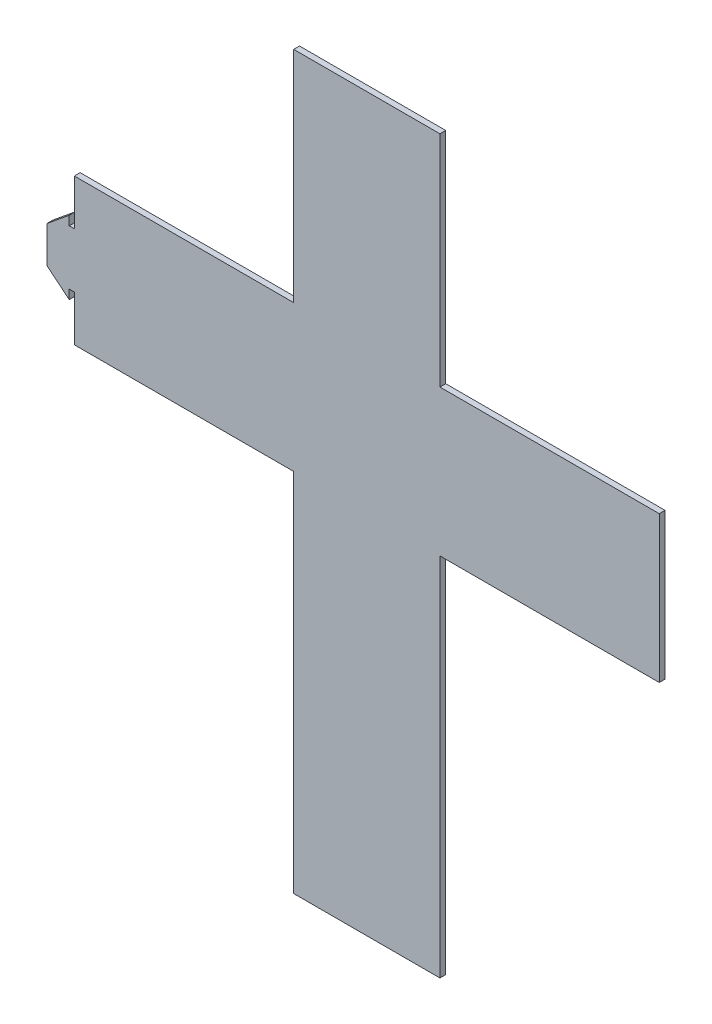
ISO-10303-21;
HEADER;
FILE_DESCRIPTION(('STEP AP214'),'2;1');
FILE_NAME('part.step','',(''),(''),'','','');
FILE_SCHEMA(('AUTOMOTIVE_DESIGN { 1 0 10303 214 1 1 1 1 }'));
ENDSEC;
DATA;
#1=APPLICATION_CONTEXT('core data for automotive mechanical design processes');
#2=APPLICATION_PROTOCOL_DEFINITION('international standard','automotive_design',2000,#1);
#3=PRODUCT_CONTEXT('',#1,'mechanical');
#4=PRODUCT('Part','Part','',(#3));
#5=PRODUCT_RELATED_PRODUCT_CATEGORY('part','',(#4));
#6=PRODUCT_DEFINITION_FORMATION('','',#4);
#7=PRODUCT_DEFINITION_CONTEXT('part definition',#1,'design');
#8=PRODUCT_DEFINITION('design','',#6,#7);
#9=PRODUCT_DEFINITION_SHAPE('','',#8);
#10=(LENGTH_UNIT() NAMED_UNIT(*) SI_UNIT(.MILLI.,.METRE.));
#11=(NAMED_UNIT(*) PLANE_ANGLE_UNIT() SI_UNIT($,.RADIAN.));
#12=(NAMED_UNIT(*) SI_UNIT($,.STERADIAN.) SOLID_ANGLE_UNIT());
#13=UNCERTAINTY_MEASURE_WITH_UNIT(LENGTH_MEASURE(1.E-05),#10,'distance_accuracy_value','');
#14=(GEOMETRIC_REPRESENTATION_CONTEXT(3) GLOBAL_UNCERTAINTY_ASSIGNED_CONTEXT((#13)) GLOBAL_UNIT_ASSIGNED_CONTEXT((#10,
#11,#12)) REPRESENTATION_CONTEXT('',''));
#15=CARTESIAN_POINT('',(0.,0.,0.));
#16=DIRECTION('',(0.,0.,1.));
#17=DIRECTION('',(1.,0.,0.));
#18=AXIS2_PLACEMENT_3D('',#15,#16,#17);
#19=CARTESIAN_POINT('',(-80.,20.,1.5875));
#20=DIRECTION('',(1.,0.,0.));
#21=DIRECTION('',(0.,0.,-1.));
#22=AXIS2_PLACEMENT_3D('',#19,#20,#21);
#23=PLANE('',#22);
#24=DIRECTION('',(0.,0.,-1.));
#25=VECTOR('',#24,1.);
#26=CARTESIAN_POINT('',(-80.,7.49999999999999,1.5875));
#27=LINE('',#26,#25);
#28=CARTESIAN_POINT('',(-80.,7.49999999999999,1.5875));
#29=VERTEX_POINT('',#28);
#30=CARTESIAN_POINT('',(-80.,7.49999999999999,0.));
#31=VERTEX_POINT('',#30);
#32=EDGE_CURVE('E281',#29,#31,#27,.T.);
#33=ORIENTED_EDGE('',*,*,#32,.F.);
#34=DIRECTION('',(0.,-1.,0.));
#35=VECTOR('',#34,1.);
#36=CARTESIAN_POINT('',(-80.,20.,1.5875));
#37=LINE('',#36,#35);
#38=CARTESIAN_POINT('',(-80.,20.,1.5875));
#39=VERTEX_POINT('',#38);
#40=EDGE_CURVE('E249',#39,#29,#37,.T.);
#41=ORIENTED_EDGE('',*,*,#40,.F.);
#42=DIRECTION('',(0.,0.,-1.));
#43=VECTOR('',#42,1.);
#44=CARTESIAN_POINT('',(-80.,20.,1.5875));
#45=LINE('',#44,#43);
#46=CARTESIAN_POINT('',(-80.,20.,0.));
#47=VERTEX_POINT('',#46);
#48=EDGE_CURVE('E204',#39,#47,#45,.T.);
#49=ORIENTED_EDGE('',*,*,#48,.T.);
#50=DIRECTION('',(0.,-1.,0.));
#51=VECTOR('',#50,1.);
#52=CARTESIAN_POINT('',(-80.,20.,0.));
#53=LINE('',#52,#51);
#54=EDGE_CURVE('E193',#47,#31,#53,.T.);
#55=ORIENTED_EDGE('',*,*,#54,.T.);
#56=EDGE_LOOP('',(#33,#41,#49,#55));
#57=FACE_BOUND('',#56,.T.);
#58=ADVANCED_FACE('F37',(#57),#23,.F.);
#59=CARTESIAN_POINT('',(20.,20.,1.5875));
#60=DIRECTION('',(0.,-1.,0.));
#61=DIRECTION('',(1.,0.,0.));
#62=AXIS2_PLACEMENT_3D('',#59,#60,#61);
#63=PLANE('',#62);
#64=DIRECTION('',(-1.,0.,0.));
#65=VECTOR('',#64,1.);
#66=CARTESIAN_POINT('',(20.,20.,0.));
#67=LINE('',#66,#65);
#68=CARTESIAN_POINT('',(80.,20.,0.));
#69=VERTEX_POINT('',#68);
#70=CARTESIAN_POINT('',(20.,20.,0.));
#71=VERTEX_POINT('',#70);
#72=EDGE_CURVE('E172',#69,#71,#67,.T.);
#73=ORIENTED_EDGE('',*,*,#72,.T.);
#74=DIRECTION('',(0.,0.,-1.));
#75=VECTOR('',#74,1.);
#76=CARTESIAN_POINT('',(20.,20.,1.5875));
#77=LINE('',#76,#75);
#78=CARTESIAN_POINT('',(20.,20.,1.5875));
#79=VERTEX_POINT('',#78);
#80=EDGE_CURVE('E11',#79,#71,#77,.T.);
#81=ORIENTED_EDGE('',*,*,#80,.F.);
#82=DIRECTION('',(-1.,0.,0.));
#83=VECTOR('',#82,1.);
#84=CARTESIAN_POINT('',(20.,20.,1.5875));
#85=LINE('',#84,#83);
#86=CARTESIAN_POINT('',(80.,20.,1.5875));
#87=VERTEX_POINT('',#86);
#88=EDGE_CURVE('E220',#87,#79,#85,.T.);
#89=ORIENTED_EDGE('',*,*,#88,.F.);
#90=DIRECTION('',(0.,0.,-1.));
#91=VECTOR('',#90,1.);
#92=CARTESIAN_POINT('',(80.,20.,1.5875));
#93=LINE('',#92,#91);
#94=EDGE_CURVE('E168',#87,#69,#93,.T.);
#95=ORIENTED_EDGE('',*,*,#94,.T.);
#96=EDGE_LOOP('',(#73,#81,#89,#95));
#97=FACE_BOUND('',#96,.T.);
#98=ADVANCED_FACE('F39',(#97),#63,.F.);
#99=CARTESIAN_POINT('',(20.,80.,1.5875));
#100=DIRECTION('',(-1.,0.,0.));
#101=DIRECTION('',(0.,-1.,0.));
#102=AXIS2_PLACEMENT_3D('',#99,#100,#101);
#103=PLANE('',#102);
#104=DIRECTION('',(0.,1.,0.));
#105=VECTOR('',#104,1.);
#106=CARTESIAN_POINT('',(20.,80.,0.));
#107=LINE('',#106,#105);
#108=CARTESIAN_POINT('',(20.,80.,0.));
#109=VERTEX_POINT('',#108);
#110=EDGE_CURVE('E175',#71,#109,#107,.T.);
#111=ORIENTED_EDGE('',*,*,#110,.T.);
#112=DIRECTION('',(0.,0.,-1.));
#113=VECTOR('',#112,1.);
#114=CARTESIAN_POINT('',(20.,80.,1.5875));
#115=LINE('',#114,#113);
#116=CARTESIAN_POINT('',(20.,80.,1.5875));
#117=VERTEX_POINT('',#116);
#118=EDGE_CURVE('E46',#117,#109,#115,.T.);
#119=ORIENTED_EDGE('',*,*,#118,.F.);
#120=DIRECTION('',(0.,1.,0.));
#121=VECTOR('',#120,1.);
#122=CARTESIAN_POINT('',(20.,80.,1.5875));
#123=LINE('',#122,#121);
#124=EDGE_CURVE('E116',#79,#117,#123,.T.);
#125=ORIENTED_EDGE('',*,*,#124,.F.);
#126=ORIENTED_EDGE('',*,*,#80,.T.);
#127=EDGE_LOOP('',(#111,#119,#125,#126));
#128=FACE_BOUND('',#127,.T.);
#129=ADVANCED_FACE('F412',(#128),#103,.F.);
#130=CARTESIAN_POINT('',(-20.,80.,1.5875));
#131=DIRECTION('',(0.,-1.,0.));
#132=DIRECTION('',(0.,0.,-1.));
#133=AXIS2_PLACEMENT_3D('',#130,#131,#132);
#134=PLANE('',#133);
#135=DIRECTION('',(-1.,0.,0.));
#136=VECTOR('',#135,1.);
#137=CARTESIAN_POINT('',(-20.,80.,0.));
#138=LINE('',#137,#136);
#139=CARTESIAN_POINT('',(-20.,80.,0.));
#140=VERTEX_POINT('',#139);
#141=EDGE_CURVE('E178',#109,#140,#138,.T.);
#142=ORIENTED_EDGE('',*,*,#141,.T.);
#143=DIRECTION('',(0.,0.,-1.));
#144=VECTOR('',#143,1.);
#145=CARTESIAN_POINT('',(-20.,80.,1.5875));
#146=LINE('',#145,#144);
#147=CARTESIAN_POINT('',(-20.,80.,1.5875));
#148=VERTEX_POINT('',#147);
#149=EDGE_CURVE('E198',#148,#140,#146,.T.);
#150=ORIENTED_EDGE('',*,*,#149,.F.);
#151=DIRECTION('',(-1.,0.,0.));
#152=VECTOR('',#151,1.);
#153=CARTESIAN_POINT('',(-20.,80.,1.5875));
#154=LINE('',#153,#152);
#155=EDGE_CURVE('E267',#117,#148,#154,.T.);
#156=ORIENTED_EDGE('',*,*,#155,.F.);
#157=ORIENTED_EDGE('',*,*,#118,.T.);
#158=EDGE_LOOP('',(#142,#150,#156,#157));
#159=FACE_BOUND('',#158,.T.);
#160=ADVANCED_FACE('F410',(#159),#134,.F.);
#161=CARTESIAN_POINT('',(-20.,20.,1.5875));
#162=DIRECTION('',(1.,0.,0.));
#163=DIRECTION('',(0.,0.,-1.));
#164=AXIS2_PLACEMENT_3D('',#161,#162,#163);
#165=PLANE('',#164);
#166=DIRECTION('',(0.,-1.,0.));
#167=VECTOR('',#166,1.);
#168=CARTESIAN_POINT('',(-20.,20.,0.));
#169=LINE('',#168,#167);
#170=CARTESIAN_POINT('',(-20.,20.,0.));
#171=VERTEX_POINT('',#170);
#172=EDGE_CURVE('E180',#140,#171,#169,.T.);
#173=ORIENTED_EDGE('',*,*,#172,.T.);
#174=DIRECTION('',(0.,0.,-1.));
#175=VECTOR('',#174,1.);
#176=CARTESIAN_POINT('',(-20.,20.,1.5875));
#177=LINE('',#176,#175);
#178=CARTESIAN_POINT('',(-20.,20.,1.5875));
#179=VERTEX_POINT('',#178);
#180=EDGE_CURVE('E201',#179,#171,#177,.T.);
#181=ORIENTED_EDGE('',*,*,#180,.F.);
#182=DIRECTION('',(0.,-1.,0.));
#183=VECTOR('',#182,1.);
#184=CARTESIAN_POINT('',(-20.,20.,1.5875));
#185=LINE('',#184,#183);
#186=EDGE_CURVE('E264',#148,#179,#185,.T.);
#187=ORIENTED_EDGE('',*,*,#186,.F.);
#188=ORIENTED_EDGE('',*,*,#149,.T.);
#189=EDGE_LOOP('',(#173,#181,#187,#188));
#190=FACE_BOUND('',#189,.T.);
#191=ADVANCED_FACE('F406',(#190),#165,.F.);
#192=CARTESIAN_POINT('',(-20.,20.,1.5875));
#193=DIRECTION('',(0.,-1.,0.));
#194=DIRECTION('',(1.,0.,0.));
#195=AXIS2_PLACEMENT_3D('',#192,#193,#194);
#196=PLANE('',#195);
#197=DIRECTION('',(-1.,0.,0.));
#198=VECTOR('',#197,1.);
#199=CARTESIAN_POINT('',(-20.,20.,0.));
#200=LINE('',#199,#198);
#201=EDGE_CURVE('E182',#171,#47,#200,.T.);
#202=ORIENTED_EDGE('',*,*,#201,.T.);
#203=ORIENTED_EDGE('',*,*,#48,.F.);
#204=DIRECTION('',(-1.,0.,0.));
#205=VECTOR('',#204,1.);
#206=CARTESIAN_POINT('',(-20.,20.,1.5875));
#207=LINE('',#206,#205);
#208=EDGE_CURVE('E252',#179,#39,#207,.T.);
#209=ORIENTED_EDGE('',*,*,#208,.F.);
#210=ORIENTED_EDGE('',*,*,#180,.T.);
#211=EDGE_LOOP('',(#202,#203,#209,#210));
#212=FACE_BOUND('',#211,.T.);
#213=ADVANCED_FACE('F404',(#212),#196,.F.);
#214=CARTESIAN_POINT('',(-80.,-7.5,1.5875));
#215=VERTEX_POINT('',#214);
#216=CARTESIAN_POINT('',(-80.,-20.,1.5875));
#217=VERTEX_POINT('',#216);
#218=EDGE_CURVE('E256',#215,#217,#37,.T.);
#219=ORIENTED_EDGE('',*,*,#218,.F.);
#220=DIRECTION('',(0.,0.,-1.));
#221=VECTOR('',#220,1.);
#222=CARTESIAN_POINT('',(-80.,-7.5,1.5875));
#223=LINE('',#222,#221);
#224=CARTESIAN_POINT('',(-80.,-7.5,0.));
#225=VERTEX_POINT('',#224);
#226=EDGE_CURVE('E176',#215,#225,#223,.T.);
#227=ORIENTED_EDGE('',*,*,#226,.T.);
#228=CARTESIAN_POINT('',(-80.,-20.,0.));
#229=VERTEX_POINT('',#228);
#230=EDGE_CURVE('E184',#225,#229,#53,.T.);
#231=ORIENTED_EDGE('',*,*,#230,.T.);
#232=DIRECTION('',(0.,0.,-1.));
#233=VECTOR('',#232,1.);
#234=CARTESIAN_POINT('',(-80.,-20.,1.5875));
#235=LINE('',#234,#233);
#236=EDGE_CURVE('E207',#217,#229,#235,.T.);
#237=ORIENTED_EDGE('',*,*,#236,.F.);
#238=EDGE_LOOP('',(#219,#227,#231,#237));
#239=FACE_BOUND('',#238,.T.);
#240=ADVANCED_FACE('F427',(#239),#23,.F.);
#241=CARTESIAN_POINT('',(-80.,-20.,1.5875));
#242=DIRECTION('',(0.,1.,0.));
#243=DIRECTION('',(-1.,0.,0.));
#244=AXIS2_PLACEMENT_3D('',#241,#242,#243);
#245=PLANE('',#244);
#246=DIRECTION('',(1.,0.,0.));
#247=VECTOR('',#246,1.);
#248=CARTESIAN_POINT('',(-80.,-20.,0.));
#249=LINE('',#248,#247);
#250=CARTESIAN_POINT('',(-20.,-20.,0.));
#251=VERTEX_POINT('',#250);
#252=EDGE_CURVE('E187',#229,#251,#249,.T.);
#253=ORIENTED_EDGE('',*,*,#252,.T.);
#254=DIRECTION('',(0.,0.,-1.));
#255=VECTOR('',#254,1.);
#256=CARTESIAN_POINT('',(-20.,-20.,1.5875));
#257=LINE('',#256,#255);
#258=CARTESIAN_POINT('',(-20.,-20.,1.5875));
#259=VERTEX_POINT('',#258);
#260=EDGE_CURVE('E210',#259,#251,#257,.T.);
#261=ORIENTED_EDGE('',*,*,#260,.F.);
#262=DIRECTION('',(1.,0.,0.));
#263=VECTOR('',#262,1.);
#264=CARTESIAN_POINT('',(-80.,-20.,1.5875));
#265=LINE('',#264,#263);
#266=EDGE_CURVE('E245',#217,#259,#265,.T.);
#267=ORIENTED_EDGE('',*,*,#266,.F.);
#268=ORIENTED_EDGE('',*,*,#236,.T.);
#269=EDGE_LOOP('',(#253,#261,#267,#268));
#270=FACE_BOUND('',#269,.T.);
#271=ADVANCED_FACE('F232',(#270),#245,.F.);
#272=CARTESIAN_POINT('',(-20.,-20.,1.5875));
#273=DIRECTION('',(1.,0.,0.));
#274=DIRECTION('',(0.,1.,0.));
#275=AXIS2_PLACEMENT_3D('',#272,#273,#274);
#276=PLANE('',#275);
#277=DIRECTION('',(0.,-1.,0.));
#278=VECTOR('',#277,1.);
#279=CARTESIAN_POINT('',(-20.,-20.,0.));
#280=LINE('',#279,#278);
#281=CARTESIAN_POINT('',(-20.,-120.,0.));
#282=VERTEX_POINT('',#281);
#283=EDGE_CURVE('E225',#251,#282,#280,.T.);
#284=ORIENTED_EDGE('',*,*,#283,.T.);
#285=DIRECTION('',(0.,0.,-1.));
#286=VECTOR('',#285,1.);
#287=CARTESIAN_POINT('',(-20.,-120.,1.5875));
#288=LINE('',#287,#286);
#289=CARTESIAN_POINT('',(-20.,-120.,1.5875));
#290=VERTEX_POINT('',#289);
#291=EDGE_CURVE('E213',#290,#282,#288,.T.);
#292=ORIENTED_EDGE('',*,*,#291,.F.);
#293=DIRECTION('',(0.,-1.,0.));
#294=VECTOR('',#293,1.);
#295=CARTESIAN_POINT('',(-20.,-20.,1.5875));
#296=LINE('',#295,#294);
#297=EDGE_CURVE('E239',#259,#290,#296,.T.);
#298=ORIENTED_EDGE('',*,*,#297,.F.);
#299=ORIENTED_EDGE('',*,*,#260,.T.);
#300=EDGE_LOOP('',(#284,#292,#298,#299));
#301=FACE_BOUND('',#300,.T.);
#302=ADVANCED_FACE('F238',(#301),#276,.F.);
#303=CARTESIAN_POINT('',(-20.,-120.,1.5875));
#304=DIRECTION('',(0.,1.,0.));
#305=DIRECTION('',(0.,0.,1.));
#306=AXIS2_PLACEMENT_3D('',#303,#304,#305);
#307=PLANE('',#306);
#308=DIRECTION('',(1.,0.,0.));
#309=VECTOR('',#308,1.);
#310=CARTESIAN_POINT('',(-20.,-120.,0.));
#311=LINE('',#310,#309);
#312=CARTESIAN_POINT('',(20.,-120.,0.));
#313=VERTEX_POINT('',#312);
#314=EDGE_CURVE('E224',#282,#313,#311,.T.);
#315=ORIENTED_EDGE('',*,*,#314,.T.);
#316=DIRECTION('',(0.,0.,-1.));
#317=VECTOR('',#316,1.);
#318=CARTESIAN_POINT('',(20.,-120.,1.5875));
#319=LINE('',#318,#317);
#320=CARTESIAN_POINT('',(20.,-120.,1.5875));
#321=VERTEX_POINT('',#320);
#322=EDGE_CURVE('E163',#321,#313,#319,.T.);
#323=ORIENTED_EDGE('',*,*,#322,.F.);
#324=DIRECTION('',(1.,0.,0.));
#325=VECTOR('',#324,1.);
#326=CARTESIAN_POINT('',(-20.,-120.,1.5875));
#327=LINE('',#326,#325);
#328=EDGE_CURVE('E151',#290,#321,#327,.T.);
#329=ORIENTED_EDGE('',*,*,#328,.F.);
#330=ORIENTED_EDGE('',*,*,#291,.T.);
#331=EDGE_LOOP('',(#315,#323,#329,#330));
#332=FACE_BOUND('',#331,.T.);
#333=ADVANCED_FACE('F244',(#332),#307,.F.);
#334=CARTESIAN_POINT('',(20.,-120.,1.5875));
#335=DIRECTION('',(-1.,0.,0.));
#336=DIRECTION('',(0.,-1.,0.));
#337=AXIS2_PLACEMENT_3D('',#334,#335,#336);
#338=PLANE('',#337);
#339=DIRECTION('',(0.,1.,0.));
#340=VECTOR('',#339,1.);
#341=CARTESIAN_POINT('',(20.,-120.,0.));
#342=LINE('',#341,#340);
#343=CARTESIAN_POINT('',(20.,-20.,0.));
#344=VERTEX_POINT('',#343);
#345=EDGE_CURVE('E160',#313,#344,#342,.T.);
#346=ORIENTED_EDGE('',*,*,#345,.T.);
#347=DIRECTION('',(0.,0.,-1.));
#348=VECTOR('',#347,1.);
#349=CARTESIAN_POINT('',(20.,-20.,1.5875));
#350=LINE('',#349,#348);
#351=CARTESIAN_POINT('',(20.,-20.,1.5875));
#352=VERTEX_POINT('',#351);
#353=EDGE_CURVE('E157',#352,#344,#350,.T.);
#354=ORIENTED_EDGE('',*,*,#353,.F.);
#355=DIRECTION('',(0.,1.,0.));
#356=VECTOR('',#355,1.);
#357=CARTESIAN_POINT('',(20.,-120.,1.5875));
#358=LINE('',#357,#356);
#359=EDGE_CURVE('E144',#321,#352,#358,.T.);
#360=ORIENTED_EDGE('',*,*,#359,.F.);
#361=ORIENTED_EDGE('',*,*,#322,.T.);
#362=EDGE_LOOP('',(#346,#354,#360,#361));
#363=FACE_BOUND('',#362,.T.);
#364=ADVANCED_FACE('F158',(#363),#338,.F.);
#365=CARTESIAN_POINT('',(80.,-20.,1.5875));
#366=DIRECTION('',(0.,1.,0.));
#367=DIRECTION('',(-1.,0.,0.));
#368=AXIS2_PLACEMENT_3D('',#365,#366,#367);
#369=PLANE('',#368);
#370=DIRECTION('',(1.,0.,0.));
#371=VECTOR('',#370,1.);
#372=CARTESIAN_POINT('',(80.,-20.,0.));
#373=LINE('',#372,#371);
#374=CARTESIAN_POINT('',(80.,-20.,0.));
#375=VERTEX_POINT('',#374);
#376=EDGE_CURVE('E221',#344,#375,#373,.T.);
#377=ORIENTED_EDGE('',*,*,#376,.T.);
#378=DIRECTION('',(0.,0.,-1.));
#379=VECTOR('',#378,1.);
#380=CARTESIAN_POINT('',(80.,-20.,1.5875));
#381=LINE('',#380,#379);
#382=CARTESIAN_POINT('',(80.,-20.,1.5875));
#383=VERTEX_POINT('',#382);
#384=EDGE_CURVE('E164',#383,#375,#381,.T.);
#385=ORIENTED_EDGE('',*,*,#384,.F.);
#386=DIRECTION('',(1.,0.,0.));
#387=VECTOR('',#386,1.);
#388=CARTESIAN_POINT('',(80.,-20.,1.5875));
#389=LINE('',#388,#387);
#390=EDGE_CURVE('E148',#352,#383,#389,.T.);
#391=ORIENTED_EDGE('',*,*,#390,.F.);
#392=ORIENTED_EDGE('',*,*,#353,.T.);
#393=EDGE_LOOP('',(#377,#385,#391,#392));
#394=FACE_BOUND('',#393,.T.);
#395=ADVANCED_FACE('F166',(#394),#369,.F.);
#396=CARTESIAN_POINT('',(80.,20.,1.5875));
#397=DIRECTION('',(-1.,0.,0.));
#398=DIRECTION('',(0.,0.,1.));
#399=AXIS2_PLACEMENT_3D('',#396,#397,#398);
#400=PLANE('',#399);
#401=DIRECTION('',(0.,1.,0.));
#402=VECTOR('',#401,1.);
#403=CARTESIAN_POINT('',(80.,20.,0.));
#404=LINE('',#403,#402);
#405=EDGE_CURVE('E108',#375,#69,#404,.T.);
#406=ORIENTED_EDGE('',*,*,#405,.T.);
#407=ORIENTED_EDGE('',*,*,#94,.F.);
#408=DIRECTION('',(0.,1.,0.));
#409=VECTOR('',#408,1.);
#410=CARTESIAN_POINT('',(80.,20.,1.5875));
#411=LINE('',#410,#409);
#412=EDGE_CURVE('E63',#383,#87,#411,.T.);
#413=ORIENTED_EDGE('',*,*,#412,.F.);
#414=ORIENTED_EDGE('',*,*,#384,.T.);
#415=EDGE_LOOP('',(#406,#407,#413,#414));
#416=FACE_BOUND('',#415,.T.);
#417=ADVANCED_FACE('F415',(#416),#400,.F.);
#418=CARTESIAN_POINT('',(0.,0.,1.5875));
#419=DIRECTION('',(0.,0.,-1.));
#420=DIRECTION('',(-1.,0.,0.));
#421=AXIS2_PLACEMENT_3D('',#418,#419,#420);
#422=PLANE('',#421);
#423=ORIENTED_EDGE('',*,*,#88,.T.);
#424=ORIENTED_EDGE('',*,*,#124,.T.);
#425=ORIENTED_EDGE('',*,*,#155,.T.);
#426=ORIENTED_EDGE('',*,*,#186,.T.);
#427=ORIENTED_EDGE('',*,*,#208,.T.);
#428=ORIENTED_EDGE('',*,*,#40,.T.);
#429=DIRECTION('',(-1.,0.,0.));
#430=VECTOR('',#429,1.);
#431=CARTESIAN_POINT('',(-80.,7.49999999999999,1.5875));
#432=LINE('',#431,#430);
#433=CARTESIAN_POINT('',(-81.4,7.49999999999999,1.5875));
#434=VERTEX_POINT('',#433);
#435=EDGE_CURVE('E285',#29,#434,#432,.T.);
#436=ORIENTED_EDGE('',*,*,#435,.T.);
#437=DIRECTION('',(0.,1.,0.));
#438=VECTOR('',#437,1.);
#439=CARTESIAN_POINT('',(-81.4,7.49999999999999,1.5875));
#440=LINE('',#439,#438);
#441=CARTESIAN_POINT('',(-81.4,9.99999999999999,1.5875));
#442=VERTEX_POINT('',#441);
#443=EDGE_CURVE('E293',#434,#442,#440,.T.);
#444=ORIENTED_EDGE('',*,*,#443,.T.);
#445=DIRECTION('',(-0.773392104960214,-0.633927954885419,0.));
#446=VECTOR('',#445,1.);
#447=CARTESIAN_POINT('',(-81.4,9.99999999999999,1.5875));
#448=LINE('',#447,#446);
#449=CARTESIAN_POINT('',(-87.5,5.,1.5875));
#450=VERTEX_POINT('',#449);
#451=EDGE_CURVE('E373',#442,#450,#448,.T.);
#452=ORIENTED_EDGE('',*,*,#451,.T.);
#453=DIRECTION('',(0.,-1.,0.));
#454=VECTOR('',#453,1.);
#455=CARTESIAN_POINT('',(-87.5,-5.,1.5875));
#456=LINE('',#455,#454);
#457=CARTESIAN_POINT('',(-87.5,-5.,1.5875));
#458=VERTEX_POINT('',#457);
#459=EDGE_CURVE('E365',#450,#458,#456,.T.);
#460=ORIENTED_EDGE('',*,*,#459,.T.);
#461=DIRECTION('',(0.773392104960212,-0.633927954885421,0.));
#462=VECTOR('',#461,1.);
#463=CARTESIAN_POINT('',(-81.4,-10.,1.5875));
#464=LINE('',#463,#462);
#465=CARTESIAN_POINT('',(-81.4,-10.,1.5875));
#466=VERTEX_POINT('',#465);
#467=EDGE_CURVE('E372',#458,#466,#464,.T.);
#468=ORIENTED_EDGE('',*,*,#467,.T.);
#469=DIRECTION('',(0.,1.,0.));
#470=VECTOR('',#469,1.);
#471=CARTESIAN_POINT('',(-81.4,-7.5,1.5875));
#472=LINE('',#471,#470);
#473=CARTESIAN_POINT('',(-81.4,-7.5,1.5875));
#474=VERTEX_POINT('',#473);
#475=EDGE_CURVE('E315',#466,#474,#472,.T.);
#476=ORIENTED_EDGE('',*,*,#475,.T.);
#477=DIRECTION('',(1.,0.,0.));
#478=VECTOR('',#477,1.);
#479=CARTESIAN_POINT('',(-80.,-7.5,1.5875));
#480=LINE('',#479,#478);
#481=EDGE_CURVE('E283',#474,#215,#480,.T.);
#482=ORIENTED_EDGE('',*,*,#481,.T.);
#483=ORIENTED_EDGE('',*,*,#218,.T.);
#484=ORIENTED_EDGE('',*,*,#266,.T.);
#485=ORIENTED_EDGE('',*,*,#297,.T.);
#486=ORIENTED_EDGE('',*,*,#328,.T.);
#487=ORIENTED_EDGE('',*,*,#359,.T.);
#488=ORIENTED_EDGE('',*,*,#390,.T.);
#489=ORIENTED_EDGE('',*,*,#412,.T.);
#490=EDGE_LOOP('',(#423,#424,#425,#426,#427,#428,#436,#444,#452,#460,#468,#476,#482,#483,#484,
#485,#486,#487,#488,#489));
#491=FACE_BOUND('',#490,.T.);
#492=ADVANCED_FACE('F146',(#491),#422,.F.);
#493=CARTESIAN_POINT('',(0.,0.,0.));
#494=DIRECTION('',(0.,0.,-1.));
#495=DIRECTION('',(-1.,0.,0.));
#496=AXIS2_PLACEMENT_3D('',#493,#494,#495);
#497=PLANE('',#496);
#498=ORIENTED_EDGE('',*,*,#72,.F.);
#499=ORIENTED_EDGE('',*,*,#405,.F.);
#500=ORIENTED_EDGE('',*,*,#376,.F.);
#501=ORIENTED_EDGE('',*,*,#345,.F.);
#502=ORIENTED_EDGE('',*,*,#314,.F.);
#503=ORIENTED_EDGE('',*,*,#283,.F.);
#504=ORIENTED_EDGE('',*,*,#252,.F.);
#505=ORIENTED_EDGE('',*,*,#230,.F.);
#506=DIRECTION('',(1.,0.,0.));
#507=VECTOR('',#506,1.);
#508=CARTESIAN_POINT('',(-80.,-7.5,0.));
#509=LINE('',#508,#507);
#510=CARTESIAN_POINT('',(-81.4,-7.5,0.));
#511=VERTEX_POINT('',#510);
#512=EDGE_CURVE('E54',#511,#225,#509,.T.);
#513=ORIENTED_EDGE('',*,*,#512,.F.);
#514=DIRECTION('',(0.,1.,0.));
#515=VECTOR('',#514,1.);
#516=CARTESIAN_POINT('',(-81.4,-7.5,0.));
#517=LINE('',#516,#515);
#518=CARTESIAN_POINT('',(-81.4,-10.,0.));
#519=VERTEX_POINT('',#518);
#520=EDGE_CURVE('E286',#519,#511,#517,.T.);
#521=ORIENTED_EDGE('',*,*,#520,.F.);
#522=DIRECTION('',(0.773392104960212,-0.633927954885421,0.));
#523=VECTOR('',#522,1.);
#524=CARTESIAN_POINT('',(-81.4,-10.,0.));
#525=LINE('',#524,#523);
#526=CARTESIAN_POINT('',(-87.5,-5.,0.));
#527=VERTEX_POINT('',#526);
#528=EDGE_CURVE('E321',#527,#519,#525,.T.);
#529=ORIENTED_EDGE('',*,*,#528,.F.);
#530=DIRECTION('',(0.,-1.,0.));
#531=VECTOR('',#530,1.);
#532=CARTESIAN_POINT('',(-87.5,-5.,0.));
#533=LINE('',#532,#531);
#534=CARTESIAN_POINT('',(-87.5,5.,0.));
#535=VERTEX_POINT('',#534);
#536=EDGE_CURVE('E312',#535,#527,#533,.T.);
#537=ORIENTED_EDGE('',*,*,#536,.F.);
#538=DIRECTION('',(-0.773392104960214,-0.633927954885419,0.));
#539=VECTOR('',#538,1.);
#540=CARTESIAN_POINT('',(-81.4,9.99999999999999,0.));
#541=LINE('',#540,#539);
#542=CARTESIAN_POINT('',(-81.4,9.99999999999999,0.));
#543=VERTEX_POINT('',#542);
#544=EDGE_CURVE('E304',#543,#535,#541,.T.);
#545=ORIENTED_EDGE('',*,*,#544,.F.);
#546=DIRECTION('',(0.,1.,0.));
#547=VECTOR('',#546,1.);
#548=CARTESIAN_POINT('',(-81.4,7.49999999999999,0.));
#549=LINE('',#548,#547);
#550=CARTESIAN_POINT('',(-81.4,7.49999999999999,0.));
#551=VERTEX_POINT('',#550);
#552=EDGE_CURVE('E297',#551,#543,#549,.T.);
#553=ORIENTED_EDGE('',*,*,#552,.F.);
#554=DIRECTION('',(-1.,0.,0.));
#555=VECTOR('',#554,1.);
#556=CARTESIAN_POINT('',(-80.,7.49999999999999,0.));
#557=LINE('',#556,#555);
#558=EDGE_CURVE('E295',#31,#551,#557,.T.);
#559=ORIENTED_EDGE('',*,*,#558,.F.);
#560=ORIENTED_EDGE('',*,*,#54,.F.);
#561=ORIENTED_EDGE('',*,*,#201,.F.);
#562=ORIENTED_EDGE('',*,*,#172,.F.);
#563=ORIENTED_EDGE('',*,*,#141,.F.);
#564=ORIENTED_EDGE('',*,*,#110,.F.);
#565=EDGE_LOOP('',(#498,#499,#500,#501,#502,#503,#504,#505,#513,#521,#529,#537,#545,#553,#559,
#560,#561,#562,#563,#564));
#566=FACE_BOUND('',#565,.T.);
#567=ADVANCED_FACE('F242',(#566),#497,.T.);
#568=CARTESIAN_POINT('',(-80.,-7.5,1.5875));
#569=DIRECTION('',(0.,1.,0.));
#570=DIRECTION('',(0.,0.,1.));
#571=AXIS2_PLACEMENT_3D('',#568,#569,#570);
#572=PLANE('',#571);
#573=ORIENTED_EDGE('',*,*,#512,.T.);
#574=ORIENTED_EDGE('',*,*,#226,.F.);
#575=ORIENTED_EDGE('',*,*,#481,.F.);
#576=DIRECTION('',(0.,0.,-1.));
#577=VECTOR('',#576,1.);
#578=CARTESIAN_POINT('',(-81.4,-7.5,1.5875));
#579=LINE('',#578,#577);
#580=EDGE_CURVE('E327',#474,#511,#579,.T.);
#581=ORIENTED_EDGE('',*,*,#580,.T.);
#582=EDGE_LOOP('',(#573,#574,#575,#581));
#583=FACE_BOUND('',#582,.T.);
#584=ADVANCED_FACE('F439',(#583),#572,.F.);
#585=CARTESIAN_POINT('',(-80.,7.49999999999999,1.5875));
#586=DIRECTION('',(0.,-1.,0.));
#587=DIRECTION('',(1.,0.,0.));
#588=AXIS2_PLACEMENT_3D('',#585,#586,#587);
#589=PLANE('',#588);
#590=ORIENTED_EDGE('',*,*,#558,.T.);
#591=DIRECTION('',(0.,0.,-1.));
#592=VECTOR('',#591,1.);
#593=CARTESIAN_POINT('',(-81.4,7.49999999999999,1.5875));
#594=LINE('',#593,#592);
#595=EDGE_CURVE('E291',#434,#551,#594,.T.);
#596=ORIENTED_EDGE('',*,*,#595,.F.);
#597=ORIENTED_EDGE('',*,*,#435,.F.);
#598=ORIENTED_EDGE('',*,*,#32,.T.);
#599=EDGE_LOOP('',(#590,#596,#597,#598));
#600=FACE_BOUND('',#599,.T.);
#601=ADVANCED_FACE('F398',(#600),#589,.F.);
#602=CARTESIAN_POINT('',(-81.4,7.49999999999999,1.5875));
#603=DIRECTION('',(-1.,0.,0.));
#604=DIRECTION('',(0.,-1.,0.));
#605=AXIS2_PLACEMENT_3D('',#602,#603,#604);
#606=PLANE('',#605);
#607=ORIENTED_EDGE('',*,*,#552,.T.);
#608=DIRECTION('',(0.,0.,-1.));
#609=VECTOR('',#608,1.);
#610=CARTESIAN_POINT('',(-81.4,9.99999999999999,1.5875));
#611=LINE('',#610,#609);
#612=EDGE_CURVE('E339',#442,#543,#611,.T.);
#613=ORIENTED_EDGE('',*,*,#612,.F.);
#614=ORIENTED_EDGE('',*,*,#443,.F.);
#615=ORIENTED_EDGE('',*,*,#595,.T.);
#616=EDGE_LOOP('',(#607,#613,#614,#615));
#617=FACE_BOUND('',#616,.T.);
#618=ADVANCED_FACE('F341',(#617),#606,.F.);
#619=CARTESIAN_POINT('',(-81.4,9.99999999999999,1.5875));
#620=DIRECTION('',(0.633927954885419,-0.773392104960213,0.));
#621=DIRECTION('',(0.773392104960213,0.633927954885419,0.));
#622=AXIS2_PLACEMENT_3D('',#619,#620,#621);
#623=PLANE('',#622);
#624=ORIENTED_EDGE('',*,*,#544,.T.);
#625=DIRECTION('',(0.,0.,-1.));
#626=VECTOR('',#625,1.);
#627=CARTESIAN_POINT('',(-87.5,5.,1.5875));
#628=LINE('',#627,#626);
#629=EDGE_CURVE('E336',#450,#535,#628,.T.);
#630=ORIENTED_EDGE('',*,*,#629,.F.);
#631=ORIENTED_EDGE('',*,*,#451,.F.);
#632=ORIENTED_EDGE('',*,*,#612,.T.);
#633=EDGE_LOOP('',(#624,#630,#631,#632));
#634=FACE_BOUND('',#633,.T.);
#635=ADVANCED_FACE('F355',(#634),#623,.F.);
#636=CARTESIAN_POINT('',(-87.5,-5.,1.5875));
#637=DIRECTION('',(1.,0.,0.));
#638=DIRECTION('',(0.,0.,-1.));
#639=AXIS2_PLACEMENT_3D('',#636,#637,#638);
#640=PLANE('',#639);
#641=ORIENTED_EDGE('',*,*,#536,.T.);
#642=DIRECTION('',(0.,0.,-1.));
#643=VECTOR('',#642,1.);
#644=CARTESIAN_POINT('',(-87.5,-5.,1.5875));
#645=LINE('',#644,#643);
#646=EDGE_CURVE('E332',#458,#527,#645,.T.);
#647=ORIENTED_EDGE('',*,*,#646,.F.);
#648=ORIENTED_EDGE('',*,*,#459,.F.);
#649=ORIENTED_EDGE('',*,*,#629,.T.);
#650=EDGE_LOOP('',(#641,#647,#648,#649));
#651=FACE_BOUND('',#650,.T.);
#652=ADVANCED_FACE('F362',(#651),#640,.F.);
#653=CARTESIAN_POINT('',(-81.4,-10.,1.5875));
#654=DIRECTION('',(0.633927954885421,0.773392104960212,0.));
#655=DIRECTION('',(-0.773392104960212,0.633927954885421,0.));
#656=AXIS2_PLACEMENT_3D('',#653,#654,#655);
#657=PLANE('',#656);
#658=ORIENTED_EDGE('',*,*,#528,.T.);
#659=DIRECTION('',(0.,0.,-1.));
#660=VECTOR('',#659,1.);
#661=CARTESIAN_POINT('',(-81.4,-10.,1.5875));
#662=LINE('',#661,#660);
#663=EDGE_CURVE('E329',#466,#519,#662,.T.);
#664=ORIENTED_EDGE('',*,*,#663,.F.);
#665=ORIENTED_EDGE('',*,*,#467,.F.);
#666=ORIENTED_EDGE('',*,*,#646,.T.);
#667=EDGE_LOOP('',(#658,#664,#665,#666));
#668=FACE_BOUND('',#667,.T.);
#669=ADVANCED_FACE('F442',(#668),#657,.F.);
#670=CARTESIAN_POINT('',(-81.4,-7.5,1.5875));
#671=DIRECTION('',(-1.,0.,0.));
#672=DIRECTION('',(0.,0.,1.));
#673=AXIS2_PLACEMENT_3D('',#670,#671,#672);
#674=PLANE('',#673);
#675=ORIENTED_EDGE('',*,*,#520,.T.);
#676=ORIENTED_EDGE('',*,*,#580,.F.);
#677=ORIENTED_EDGE('',*,*,#475,.F.);
#678=ORIENTED_EDGE('',*,*,#663,.T.);
#679=EDGE_LOOP('',(#675,#676,#677,#678));
#680=FACE_BOUND('',#679,.T.);
#681=ADVANCED_FACE('F441',(#680),#674,.F.);
#682=CLOSED_SHELL('',(#58,#98,#129,#160,#191,#213,#240,#271,#302,#333,#364,#395,#417,#492,#567,
#584,#601,#618,#635,#652,#669,#681));
#683=MANIFOLD_SOLID_BREP('B2',#682);
#684=ADVANCED_BREP_SHAPE_REPRESENTATION('',(#18,#683),#14);
#685=SHAPE_DEFINITION_REPRESENTATION(#9,#684);
ENDSEC;
END-ISO-10303-21;
